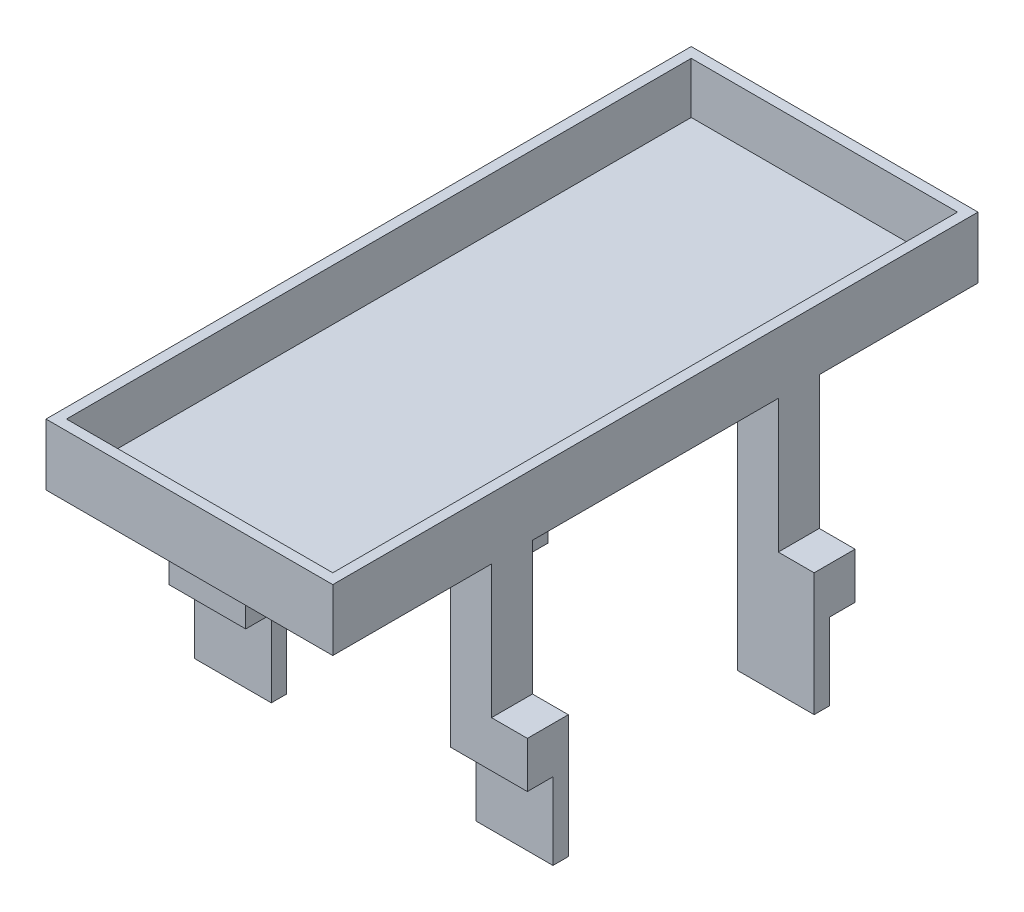
ISO-10303-21;
HEADER;
FILE_DESCRIPTION(('STEP AP214'),'2;1');
FILE_NAME('part.step','',(''),(''),'','','');
FILE_SCHEMA(('AUTOMOTIVE_DESIGN { 1 0 10303 214 1 1 1 1 }'));
ENDSEC;
DATA;
#1=APPLICATION_CONTEXT('core data for automotive mechanical design processes');
#2=APPLICATION_PROTOCOL_DEFINITION('international standard','automotive_design',2000,#1);
#3=PRODUCT_CONTEXT('',#1,'mechanical');
#4=PRODUCT('Part','Part','',(#3));
#5=PRODUCT_RELATED_PRODUCT_CATEGORY('part','',(#4));
#6=PRODUCT_DEFINITION_FORMATION('','',#4);
#7=PRODUCT_DEFINITION_CONTEXT('part definition',#1,'design');
#8=PRODUCT_DEFINITION('design','',#6,#7);
#9=PRODUCT_DEFINITION_SHAPE('','',#8);
#10=(LENGTH_UNIT() NAMED_UNIT(*) SI_UNIT(.MILLI.,.METRE.));
#11=(NAMED_UNIT(*) PLANE_ANGLE_UNIT() SI_UNIT($,.RADIAN.));
#12=(NAMED_UNIT(*) SI_UNIT($,.STERADIAN.) SOLID_ANGLE_UNIT());
#13=UNCERTAINTY_MEASURE_WITH_UNIT(LENGTH_MEASURE(1.E-05),#10,'distance_accuracy_value','');
#14=(GEOMETRIC_REPRESENTATION_CONTEXT(3) GLOBAL_UNCERTAINTY_ASSIGNED_CONTEXT((#13)) GLOBAL_UNIT_ASSIGNED_CONTEXT((#10,
#11,#12)) REPRESENTATION_CONTEXT('',''));
#15=CARTESIAN_POINT('',(0.,0.,0.));
#16=DIRECTION('',(0.,0.,1.));
#17=DIRECTION('',(1.,0.,0.));
#18=AXIS2_PLACEMENT_3D('',#15,#16,#17);
#19=CARTESIAN_POINT('',(35.,0.,-24.));
#20=DIRECTION('',(0.,0.,-1.));
#21=DIRECTION('',(0.,1.,0.));
#22=AXIS2_PLACEMENT_3D('',#19,#20,#21);
#23=PLANE('',#22);
#24=DIRECTION('',(-1.,0.,0.));
#25=VECTOR('',#24,1.);
#26=CARTESIAN_POINT('',(35.,0.,-24.));
#27=LINE('',#26,#25);
#28=CARTESIAN_POINT('',(-20.,0.,-24.));
#29=VERTEX_POINT('',#28);
#30=CARTESIAN_POINT('',(-28.,0.,-24.));
#31=VERTEX_POINT('',#30);
#32=EDGE_CURVE('E542',#29,#31,#27,.T.);
#33=ORIENTED_EDGE('',*,*,#32,.T.);
#34=DIRECTION('',(0.,-1.,0.));
#35=VECTOR('',#34,1.);
#36=CARTESIAN_POINT('',(-28.,0.,-24.));
#37=LINE('',#36,#35);
#38=CARTESIAN_POINT('',(-28.,-26.,-24.));
#39=VERTEX_POINT('',#38);
#40=EDGE_CURVE('E306',#31,#39,#37,.T.);
#41=ORIENTED_EDGE('',*,*,#40,.T.);
#42=DIRECTION('',(-1.,0.,0.));
#43=VECTOR('',#42,1.);
#44=CARTESIAN_POINT('',(35.,-26.,-24.));
#45=LINE('',#44,#43);
#46=CARTESIAN_POINT('',(-35.,-26.,-24.));
#47=VERTEX_POINT('',#46);
#48=EDGE_CURVE('E314',#39,#47,#45,.T.);
#49=ORIENTED_EDGE('',*,*,#48,.T.);
#50=DIRECTION('',(0.,-1.,0.));
#51=VECTOR('',#50,1.);
#52=CARTESIAN_POINT('',(-35.,0.,-24.));
#53=LINE('',#52,#51);
#54=CARTESIAN_POINT('',(-35.,-50.,-24.));
#55=VERTEX_POINT('',#54);
#56=EDGE_CURVE('E499',#47,#55,#53,.T.);
#57=ORIENTED_EDGE('',*,*,#56,.T.);
#58=DIRECTION('',(-1.,0.,0.));
#59=VECTOR('',#58,1.);
#60=CARTESIAN_POINT('',(35.,-50.,-24.));
#61=LINE('',#60,#59);
#62=CARTESIAN_POINT('',(-20.,-50.,-24.));
#63=VERTEX_POINT('',#62);
#64=EDGE_CURVE('E538',#63,#55,#61,.T.);
#65=ORIENTED_EDGE('',*,*,#64,.F.);
#66=DIRECTION('',(0.,1.,0.));
#67=VECTOR('',#66,1.);
#68=CARTESIAN_POINT('',(-20.,0.,-24.));
#69=LINE('',#68,#67);
#70=EDGE_CURVE('E380',#63,#29,#69,.T.);
#71=ORIENTED_EDGE('',*,*,#70,.T.);
#72=EDGE_LOOP('',(#33,#41,#49,#57,#65,#71));
#73=FACE_BOUND('',#72,.T.);
#74=ADVANCED_FACE('F37',(#73),#23,.F.);
#75=CARTESIAN_POINT('',(35.,-50.,-24.));
#76=DIRECTION('',(0.,1.,0.));
#77=DIRECTION('',(0.,0.,1.));
#78=AXIS2_PLACEMENT_3D('',#75,#76,#77);
#79=PLANE('',#78);
#80=DIRECTION('',(-1.,0.,0.));
#81=VECTOR('',#80,1.);
#82=CARTESIAN_POINT('',(35.,-50.,-27.));
#83=LINE('',#82,#81);
#84=CARTESIAN_POINT('',(-20.,-50.,-27.));
#85=VERTEX_POINT('',#84);
#86=CARTESIAN_POINT('',(-35.,-50.,-27.));
#87=VERTEX_POINT('',#86);
#88=EDGE_CURVE('E534',#85,#87,#83,.T.);
#89=ORIENTED_EDGE('',*,*,#88,.F.);
#90=DIRECTION('',(0.,0.,1.));
#91=VECTOR('',#90,1.);
#92=CARTESIAN_POINT('',(-20.,-50.,-63.));
#93=LINE('',#92,#91);
#94=EDGE_CURVE('E634',#85,#63,#93,.T.);
#95=ORIENTED_EDGE('',*,*,#94,.T.);
#96=ORIENTED_EDGE('',*,*,#64,.T.);
#97=DIRECTION('',(0.,0.,-1.));
#98=VECTOR('',#97,1.);
#99=CARTESIAN_POINT('',(-35.,-50.,-24.));
#100=LINE('',#99,#98);
#101=EDGE_CURVE('E514',#55,#87,#100,.T.);
#102=ORIENTED_EDGE('',*,*,#101,.T.);
#103=EDGE_LOOP('',(#89,#95,#96,#102));
#104=FACE_BOUND('',#103,.T.);
#105=ADVANCED_FACE('F655',(#104),#79,.F.);
#106=CARTESIAN_POINT('',(35.,-50.,-27.));
#107=DIRECTION('',(0.,0.,1.));
#108=DIRECTION('',(1.,0.,0.));
#109=AXIS2_PLACEMENT_3D('',#106,#107,#108);
#110=PLANE('',#109);
#111=DIRECTION('',(-1.,0.,0.));
#112=VECTOR('',#111,1.);
#113=CARTESIAN_POINT('',(35.,-35.,-27.));
#114=LINE('',#113,#112);
#115=CARTESIAN_POINT('',(-20.,-35.,-27.));
#116=VERTEX_POINT('',#115);
#117=CARTESIAN_POINT('',(-35.,-35.,-27.));
#118=VERTEX_POINT('',#117);
#119=EDGE_CURVE('E529',#116,#118,#114,.T.);
#120=ORIENTED_EDGE('',*,*,#119,.F.);
#121=DIRECTION('',(0.,-1.,0.));
#122=VECTOR('',#121,1.);
#123=CARTESIAN_POINT('',(-20.,-50.,-27.));
#124=LINE('',#123,#122);
#125=EDGE_CURVE('E377',#116,#85,#124,.T.);
#126=ORIENTED_EDGE('',*,*,#125,.T.);
#127=ORIENTED_EDGE('',*,*,#88,.T.);
#128=DIRECTION('',(0.,1.,0.));
#129=VECTOR('',#128,1.);
#130=CARTESIAN_POINT('',(-35.,-50.,-27.));
#131=LINE('',#130,#129);
#132=EDGE_CURVE('E517',#87,#118,#131,.T.);
#133=ORIENTED_EDGE('',*,*,#132,.T.);
#134=EDGE_LOOP('',(#120,#126,#127,#133));
#135=FACE_BOUND('',#134,.T.);
#136=ADVANCED_FACE('F659',(#135),#110,.F.);
#137=CARTESIAN_POINT('',(35.,-35.,-27.));
#138=DIRECTION('',(0.,1.,0.));
#139=DIRECTION('',(0.,0.,1.));
#140=AXIS2_PLACEMENT_3D('',#137,#138,#139);
#141=PLANE('',#140);
#142=DIRECTION('',(-1.,0.,0.));
#143=VECTOR('',#142,1.);
#144=CARTESIAN_POINT('',(35.,-35.,-32.));
#145=LINE('',#144,#143);
#146=CARTESIAN_POINT('',(-20.,-35.,-32.));
#147=VERTEX_POINT('',#146);
#148=CARTESIAN_POINT('',(-35.,-35.,-32.));
#149=VERTEX_POINT('',#148);
#150=EDGE_CURVE('E530',#147,#149,#145,.T.);
#151=ORIENTED_EDGE('',*,*,#150,.F.);
#152=DIRECTION('',(0.,0.,1.));
#153=VECTOR('',#152,1.);
#154=CARTESIAN_POINT('',(-20.,-35.,-27.));
#155=LINE('',#154,#153);
#156=EDGE_CURVE('E374',#147,#116,#155,.T.);
#157=ORIENTED_EDGE('',*,*,#156,.T.);
#158=ORIENTED_EDGE('',*,*,#119,.T.);
#159=DIRECTION('',(0.,0.,-1.));
#160=VECTOR('',#159,1.);
#161=CARTESIAN_POINT('',(-35.,-35.,-27.));
#162=LINE('',#161,#160);
#163=EDGE_CURVE('E520',#118,#149,#162,.T.);
#164=ORIENTED_EDGE('',*,*,#163,.T.);
#165=EDGE_LOOP('',(#151,#157,#158,#164));
#166=FACE_BOUND('',#165,.T.);
#167=ADVANCED_FACE('F606',(#166),#141,.F.);
#168=CARTESIAN_POINT('',(35.,-35.,-32.));
#169=DIRECTION('',(0.,0.,1.));
#170=DIRECTION('',(1.,0.,0.));
#171=AXIS2_PLACEMENT_3D('',#168,#169,#170);
#172=PLANE('',#171);
#173=DIRECTION('',(1.,0.,0.));
#174=VECTOR('',#173,1.);
#175=CARTESIAN_POINT('',(35.,-26.,-32.));
#176=LINE('',#175,#174);
#177=CARTESIAN_POINT('',(-35.,-26.,-32.));
#178=VERTEX_POINT('',#177);
#179=CARTESIAN_POINT('',(-28.,-26.,-32.));
#180=VERTEX_POINT('',#179);
#181=EDGE_CURVE('E311',#178,#180,#176,.T.);
#182=ORIENTED_EDGE('',*,*,#181,.T.);
#183=DIRECTION('',(0.,1.,0.));
#184=VECTOR('',#183,1.);
#185=CARTESIAN_POINT('',(-28.,-35.,-32.));
#186=LINE('',#185,#184);
#187=CARTESIAN_POINT('',(-28.,0.,-32.));
#188=VERTEX_POINT('',#187);
#189=EDGE_CURVE('E294',#180,#188,#186,.T.);
#190=ORIENTED_EDGE('',*,*,#189,.T.);
#191=DIRECTION('',(-1.,0.,0.));
#192=VECTOR('',#191,1.);
#193=CARTESIAN_POINT('',(35.,0.,-32.));
#194=LINE('',#193,#192);
#195=CARTESIAN_POINT('',(-20.,0.,-32.));
#196=VERTEX_POINT('',#195);
#197=EDGE_CURVE('E511',#196,#188,#194,.T.);
#198=ORIENTED_EDGE('',*,*,#197,.F.);
#199=DIRECTION('',(0.,-1.,0.));
#200=VECTOR('',#199,1.);
#201=CARTESIAN_POINT('',(-20.,-35.,-32.));
#202=LINE('',#201,#200);
#203=EDGE_CURVE('E371',#196,#147,#202,.T.);
#204=ORIENTED_EDGE('',*,*,#203,.T.);
#205=ORIENTED_EDGE('',*,*,#150,.T.);
#206=DIRECTION('',(0.,1.,0.));
#207=VECTOR('',#206,1.);
#208=CARTESIAN_POINT('',(-35.,-35.,-32.));
#209=LINE('',#208,#207);
#210=EDGE_CURVE('E321',#149,#178,#209,.T.);
#211=ORIENTED_EDGE('',*,*,#210,.T.);
#212=EDGE_LOOP('',(#182,#190,#198,#204,#205,#211));
#213=FACE_BOUND('',#212,.T.);
#214=ADVANCED_FACE('F319',(#213),#172,.F.);
#215=CARTESIAN_POINT('',(35.,-35.,32.));
#216=DIRECTION('',(0.,0.,-1.));
#217=DIRECTION('',(-1.,0.,0.));
#218=AXIS2_PLACEMENT_3D('',#215,#216,#217);
#219=PLANE('',#218);
#220=DIRECTION('',(-1.,0.,0.));
#221=VECTOR('',#220,1.);
#222=CARTESIAN_POINT('',(0.,0.,32.));
#223=LINE('',#222,#221);
#224=CARTESIAN_POINT('',(-20.,0.,32.));
#225=VERTEX_POINT('',#224);
#226=CARTESIAN_POINT('',(-28.,0.,32.));
#227=VERTEX_POINT('',#226);
#228=EDGE_CURVE('E549',#225,#227,#223,.T.);
#229=ORIENTED_EDGE('',*,*,#228,.T.);
#230=DIRECTION('',(0.,-1.,0.));
#231=VECTOR('',#230,1.);
#232=CARTESIAN_POINT('',(-28.,-35.,32.));
#233=LINE('',#232,#231);
#234=CARTESIAN_POINT('',(-28.,-26.,32.));
#235=VERTEX_POINT('',#234);
#236=EDGE_CURVE('E307',#227,#235,#233,.T.);
#237=ORIENTED_EDGE('',*,*,#236,.T.);
#238=DIRECTION('',(-1.,0.,0.));
#239=VECTOR('',#238,1.);
#240=CARTESIAN_POINT('',(35.,-26.,32.));
#241=LINE('',#240,#239);
#242=CARTESIAN_POINT('',(-35.,-26.,32.));
#243=VERTEX_POINT('',#242);
#244=EDGE_CURVE('E322',#235,#243,#241,.T.);
#245=ORIENTED_EDGE('',*,*,#244,.T.);
#246=DIRECTION('',(0.,-1.,0.));
#247=VECTOR('',#246,1.);
#248=CARTESIAN_POINT('',(-35.,-35.,32.));
#249=LINE('',#248,#247);
#250=CARTESIAN_POINT('',(-35.,-35.,32.));
#251=VERTEX_POINT('',#250);
#252=EDGE_CURVE('E455',#243,#251,#249,.T.);
#253=ORIENTED_EDGE('',*,*,#252,.T.);
#254=DIRECTION('',(-1.,0.,0.));
#255=VECTOR('',#254,1.);
#256=CARTESIAN_POINT('',(35.,-35.,32.));
#257=LINE('',#256,#255);
#258=CARTESIAN_POINT('',(-20.,-35.,32.));
#259=VERTEX_POINT('',#258);
#260=EDGE_CURVE('E419',#259,#251,#257,.T.);
#261=ORIENTED_EDGE('',*,*,#260,.F.);
#262=DIRECTION('',(0.,1.,0.));
#263=VECTOR('',#262,1.);
#264=CARTESIAN_POINT('',(-20.,-35.,32.));
#265=LINE('',#264,#263);
#266=EDGE_CURVE('E368',#259,#225,#265,.T.);
#267=ORIENTED_EDGE('',*,*,#266,.T.);
#268=EDGE_LOOP('',(#229,#237,#245,#253,#261,#267));
#269=FACE_BOUND('',#268,.T.);
#270=ADVANCED_FACE('F725',(#269),#219,.F.);
#271=CARTESIAN_POINT('',(35.,-35.,27.));
#272=DIRECTION('',(0.,1.,0.));
#273=DIRECTION('',(0.,0.,1.));
#274=AXIS2_PLACEMENT_3D('',#271,#272,#273);
#275=PLANE('',#274);
#276=DIRECTION('',(-1.,0.,0.));
#277=VECTOR('',#276,1.);
#278=CARTESIAN_POINT('',(35.,-35.,27.));
#279=LINE('',#278,#277);
#280=CARTESIAN_POINT('',(-20.,-35.,27.));
#281=VERTEX_POINT('',#280);
#282=CARTESIAN_POINT('',(-35.,-35.,27.));
#283=VERTEX_POINT('',#282);
#284=EDGE_CURVE('E429',#281,#283,#279,.T.);
#285=ORIENTED_EDGE('',*,*,#284,.F.);
#286=DIRECTION('',(0.,0.,1.));
#287=VECTOR('',#286,1.);
#288=CARTESIAN_POINT('',(-20.,-35.,27.));
#289=LINE('',#288,#287);
#290=EDGE_CURVE('E365',#281,#259,#289,.T.);
#291=ORIENTED_EDGE('',*,*,#290,.T.);
#292=ORIENTED_EDGE('',*,*,#260,.T.);
#293=DIRECTION('',(0.,0.,-1.));
#294=VECTOR('',#293,1.);
#295=CARTESIAN_POINT('',(-35.,-35.,27.));
#296=LINE('',#295,#294);
#297=EDGE_CURVE('E452',#251,#283,#296,.T.);
#298=ORIENTED_EDGE('',*,*,#297,.T.);
#299=EDGE_LOOP('',(#285,#291,#292,#298));
#300=FACE_BOUND('',#299,.T.);
#301=ADVANCED_FACE('F717',(#300),#275,.F.);
#302=CARTESIAN_POINT('',(35.,-50.,27.));
#303=DIRECTION('',(0.,0.,-1.));
#304=DIRECTION('',(-1.,0.,0.));
#305=AXIS2_PLACEMENT_3D('',#302,#303,#304);
#306=PLANE('',#305);
#307=DIRECTION('',(-1.,0.,0.));
#308=VECTOR('',#307,1.);
#309=CARTESIAN_POINT('',(35.,-50.,27.));
#310=LINE('',#309,#308);
#311=CARTESIAN_POINT('',(-20.,-50.,27.));
#312=VERTEX_POINT('',#311);
#313=CARTESIAN_POINT('',(-35.,-50.,27.));
#314=VERTEX_POINT('',#313);
#315=EDGE_CURVE('E433',#312,#314,#310,.T.);
#316=ORIENTED_EDGE('',*,*,#315,.F.);
#317=DIRECTION('',(0.,1.,0.));
#318=VECTOR('',#317,1.);
#319=CARTESIAN_POINT('',(-20.,-50.,27.));
#320=LINE('',#319,#318);
#321=EDGE_CURVE('E362',#312,#281,#320,.T.);
#322=ORIENTED_EDGE('',*,*,#321,.T.);
#323=ORIENTED_EDGE('',*,*,#284,.T.);
#324=DIRECTION('',(0.,-1.,0.));
#325=VECTOR('',#324,1.);
#326=CARTESIAN_POINT('',(-35.,-50.,27.));
#327=LINE('',#326,#325);
#328=EDGE_CURVE('E449',#283,#314,#327,.T.);
#329=ORIENTED_EDGE('',*,*,#328,.T.);
#330=EDGE_LOOP('',(#316,#322,#323,#329));
#331=FACE_BOUND('',#330,.T.);
#332=ADVANCED_FACE('F723',(#331),#306,.F.);
#333=CARTESIAN_POINT('',(35.,-50.,24.));
#334=DIRECTION('',(0.,1.,0.));
#335=DIRECTION('',(0.,0.,1.));
#336=AXIS2_PLACEMENT_3D('',#333,#334,#335);
#337=PLANE('',#336);
#338=DIRECTION('',(-1.,0.,0.));
#339=VECTOR('',#338,1.);
#340=CARTESIAN_POINT('',(35.,-50.,24.));
#341=LINE('',#340,#339);
#342=CARTESIAN_POINT('',(-20.,-50.,24.));
#343=VERTEX_POINT('',#342);
#344=CARTESIAN_POINT('',(-35.,-50.,24.));
#345=VERTEX_POINT('',#344);
#346=EDGE_CURVE('E437',#343,#345,#341,.T.);
#347=ORIENTED_EDGE('',*,*,#346,.F.);
#348=EDGE_CURVE('E637',#343,#312,#93,.T.);
#349=ORIENTED_EDGE('',*,*,#348,.T.);
#350=ORIENTED_EDGE('',*,*,#315,.T.);
#351=DIRECTION('',(0.,0.,-1.));
#352=VECTOR('',#351,1.);
#353=CARTESIAN_POINT('',(-35.,-50.,24.));
#354=LINE('',#353,#352);
#355=EDGE_CURVE('E445',#314,#345,#354,.T.);
#356=ORIENTED_EDGE('',*,*,#355,.T.);
#357=EDGE_LOOP('',(#347,#349,#350,#356));
#358=FACE_BOUND('',#357,.T.);
#359=ADVANCED_FACE('F677',(#358),#337,.F.);
#360=CARTESIAN_POINT('',(35.,0.,24.));
#361=DIRECTION('',(0.,0.,1.));
#362=DIRECTION('',(0.,-1.,0.));
#363=AXIS2_PLACEMENT_3D('',#360,#361,#362);
#364=PLANE('',#363);
#365=DIRECTION('',(1.,0.,0.));
#366=VECTOR('',#365,1.);
#367=CARTESIAN_POINT('',(35.,-26.,24.));
#368=LINE('',#367,#366);
#369=CARTESIAN_POINT('',(-35.,-26.,24.));
#370=VERTEX_POINT('',#369);
#371=CARTESIAN_POINT('',(-28.,-26.,24.));
#372=VERTEX_POINT('',#371);
#373=EDGE_CURVE('E327',#370,#372,#368,.T.);
#374=ORIENTED_EDGE('',*,*,#373,.T.);
#375=DIRECTION('',(0.,1.,0.));
#376=VECTOR('',#375,1.);
#377=CARTESIAN_POINT('',(-28.,0.,24.));
#378=LINE('',#377,#376);
#379=CARTESIAN_POINT('',(-28.,0.,24.));
#380=VERTEX_POINT('',#379);
#381=EDGE_CURVE('E45',#372,#380,#378,.T.);
#382=ORIENTED_EDGE('',*,*,#381,.T.);
#383=DIRECTION('',(1.,0.,0.));
#384=VECTOR('',#383,1.);
#385=CARTESIAN_POINT('',(0.,0.,24.));
#386=LINE('',#385,#384);
#387=CARTESIAN_POINT('',(-20.,0.,24.));
#388=VERTEX_POINT('',#387);
#389=EDGE_CURVE('E546',#380,#388,#386,.T.);
#390=ORIENTED_EDGE('',*,*,#389,.T.);
#391=DIRECTION('',(0.,-1.,0.));
#392=VECTOR('',#391,1.);
#393=CARTESIAN_POINT('',(-20.,0.,24.));
#394=LINE('',#393,#392);
#395=EDGE_CURVE('E561',#388,#343,#394,.T.);
#396=ORIENTED_EDGE('',*,*,#395,.T.);
#397=ORIENTED_EDGE('',*,*,#346,.T.);
#398=DIRECTION('',(0.,1.,0.));
#399=VECTOR('',#398,1.);
#400=CARTESIAN_POINT('',(-35.,0.,24.));
#401=LINE('',#400,#399);
#402=EDGE_CURVE('E442',#345,#370,#401,.T.);
#403=ORIENTED_EDGE('',*,*,#402,.T.);
#404=EDGE_LOOP('',(#374,#382,#390,#396,#397,#403));
#405=FACE_BOUND('',#404,.T.);
#406=ADVANCED_FACE('F566',(#405),#364,.F.);
#407=DIRECTION('',(0.,-1.,0.));
#408=VECTOR('',#407,1.);
#409=CARTESIAN_POINT('',(35.,0.,-24.));
#410=LINE('',#409,#408);
#411=CARTESIAN_POINT('',(35.,-26.,-24.));
#412=VERTEX_POINT('',#411);
#413=CARTESIAN_POINT('',(35.,-50.,-24.));
#414=VERTEX_POINT('',#413);
#415=EDGE_CURVE('E500',#412,#414,#410,.T.);
#416=ORIENTED_EDGE('',*,*,#415,.F.);
#417=DIRECTION('',(-1.,0.,0.));
#418=VECTOR('',#417,1.);
#419=CARTESIAN_POINT('',(35.,-26.,-24.));
#420=LINE('',#419,#418);
#421=CARTESIAN_POINT('',(28.,-26.,-24.));
#422=VERTEX_POINT('',#421);
#423=EDGE_CURVE('E339',#412,#422,#420,.T.);
#424=ORIENTED_EDGE('',*,*,#423,.T.);
#425=DIRECTION('',(0.,1.,0.));
#426=VECTOR('',#425,1.);
#427=CARTESIAN_POINT('',(28.,0.,-24.));
#428=LINE('',#427,#426);
#429=CARTESIAN_POINT('',(28.,0.,-24.));
#430=VERTEX_POINT('',#429);
#431=EDGE_CURVE('E391',#422,#430,#428,.T.);
#432=ORIENTED_EDGE('',*,*,#431,.T.);
#433=CARTESIAN_POINT('',(20.,0.,-24.));
#434=VERTEX_POINT('',#433);
#435=EDGE_CURVE('E545',#430,#434,#27,.T.);
#436=ORIENTED_EDGE('',*,*,#435,.T.);
#437=DIRECTION('',(0.,-1.,0.));
#438=VECTOR('',#437,1.);
#439=CARTESIAN_POINT('',(20.,0.,-24.));
#440=LINE('',#439,#438);
#441=CARTESIAN_POINT('',(20.,-50.,-24.));
#442=VERTEX_POINT('',#441);
#443=EDGE_CURVE('E359',#434,#442,#440,.T.);
#444=ORIENTED_EDGE('',*,*,#443,.T.);
#445=EDGE_CURVE('E539',#414,#442,#61,.T.);
#446=ORIENTED_EDGE('',*,*,#445,.F.);
#447=EDGE_LOOP('',(#416,#424,#432,#436,#444,#446));
#448=FACE_BOUND('',#447,.T.);
#449=ADVANCED_FACE('F39',(#448),#23,.F.);
#450=ORIENTED_EDGE('',*,*,#445,.T.);
#451=DIRECTION('',(0.,0.,1.));
#452=VECTOR('',#451,1.);
#453=CARTESIAN_POINT('',(20.,-50.,-63.));
#454=LINE('',#453,#452);
#455=CARTESIAN_POINT('',(20.,-50.,-27.));
#456=VERTEX_POINT('',#455);
#457=EDGE_CURVE('E626',#456,#442,#454,.T.);
#458=ORIENTED_EDGE('',*,*,#457,.F.);
#459=CARTESIAN_POINT('',(35.,-50.,-27.));
#460=VERTEX_POINT('',#459);
#461=EDGE_CURVE('E535',#460,#456,#83,.T.);
#462=ORIENTED_EDGE('',*,*,#461,.F.);
#463=DIRECTION('',(0.,0.,-1.));
#464=VECTOR('',#463,1.);
#465=CARTESIAN_POINT('',(35.,-50.,-24.));
#466=LINE('',#465,#464);
#467=EDGE_CURVE('E502',#414,#460,#466,.T.);
#468=ORIENTED_EDGE('',*,*,#467,.F.);
#469=EDGE_LOOP('',(#450,#458,#462,#468));
#470=FACE_BOUND('',#469,.T.);
#471=ADVANCED_FACE('F628',(#470),#79,.F.);
#472=ORIENTED_EDGE('',*,*,#461,.T.);
#473=DIRECTION('',(0.,1.,0.));
#474=VECTOR('',#473,1.);
#475=CARTESIAN_POINT('',(20.,-50.,-27.));
#476=LINE('',#475,#474);
#477=CARTESIAN_POINT('',(20.,-35.,-27.));
#478=VERTEX_POINT('',#477);
#479=EDGE_CURVE('E356',#456,#478,#476,.T.);
#480=ORIENTED_EDGE('',*,*,#479,.T.);
#481=CARTESIAN_POINT('',(35.,-35.,-27.));
#482=VERTEX_POINT('',#481);
#483=EDGE_CURVE('E531',#482,#478,#114,.T.);
#484=ORIENTED_EDGE('',*,*,#483,.F.);
#485=DIRECTION('',(0.,1.,0.));
#486=VECTOR('',#485,1.);
#487=CARTESIAN_POINT('',(35.,-50.,-27.));
#488=LINE('',#487,#486);
#489=EDGE_CURVE('E504',#460,#482,#488,.T.);
#490=ORIENTED_EDGE('',*,*,#489,.F.);
#491=EDGE_LOOP('',(#472,#480,#484,#490));
#492=FACE_BOUND('',#491,.T.);
#493=ADVANCED_FACE('F623',(#492),#110,.F.);
#494=ORIENTED_EDGE('',*,*,#483,.T.);
#495=DIRECTION('',(0.,0.,-1.));
#496=VECTOR('',#495,1.);
#497=CARTESIAN_POINT('',(20.,-35.,-27.));
#498=LINE('',#497,#496);
#499=CARTESIAN_POINT('',(20.,-35.,-32.));
#500=VERTEX_POINT('',#499);
#501=EDGE_CURVE('E353',#478,#500,#498,.T.);
#502=ORIENTED_EDGE('',*,*,#501,.T.);
#503=CARTESIAN_POINT('',(35.,-35.,-32.));
#504=VERTEX_POINT('',#503);
#505=EDGE_CURVE('E526',#504,#500,#145,.T.);
#506=ORIENTED_EDGE('',*,*,#505,.F.);
#507=DIRECTION('',(0.,0.,-1.));
#508=VECTOR('',#507,1.);
#509=CARTESIAN_POINT('',(35.,-35.,-27.));
#510=LINE('',#509,#508);
#511=EDGE_CURVE('E506',#482,#504,#510,.T.);
#512=ORIENTED_EDGE('',*,*,#511,.F.);
#513=EDGE_LOOP('',(#494,#502,#506,#512));
#514=FACE_BOUND('',#513,.T.);
#515=ADVANCED_FACE('F618',(#514),#141,.F.);
#516=DIRECTION('',(0.,-1.,0.));
#517=VECTOR('',#516,1.);
#518=CARTESIAN_POINT('',(28.,-35.,-32.));
#519=LINE('',#518,#517);
#520=CARTESIAN_POINT('',(28.,0.,-32.));
#521=VERTEX_POINT('',#520);
#522=CARTESIAN_POINT('',(28.,-26.,-32.));
#523=VERTEX_POINT('',#522);
#524=EDGE_CURVE('E388',#521,#523,#519,.T.);
#525=ORIENTED_EDGE('',*,*,#524,.T.);
#526=DIRECTION('',(1.,0.,0.));
#527=VECTOR('',#526,1.);
#528=CARTESIAN_POINT('',(35.,-26.,-32.));
#529=LINE('',#528,#527);
#530=CARTESIAN_POINT('',(35.,-26.,-32.));
#531=VERTEX_POINT('',#530);
#532=EDGE_CURVE('E336',#523,#531,#529,.T.);
#533=ORIENTED_EDGE('',*,*,#532,.T.);
#534=DIRECTION('',(0.,1.,0.));
#535=VECTOR('',#534,1.);
#536=CARTESIAN_POINT('',(35.,-35.,-32.));
#537=LINE('',#536,#535);
#538=EDGE_CURVE('E508',#504,#531,#537,.T.);
#539=ORIENTED_EDGE('',*,*,#538,.F.);
#540=ORIENTED_EDGE('',*,*,#505,.T.);
#541=DIRECTION('',(0.,1.,0.));
#542=VECTOR('',#541,1.);
#543=CARTESIAN_POINT('',(20.,-35.,-32.));
#544=LINE('',#543,#542);
#545=CARTESIAN_POINT('',(20.,0.,-32.));
#546=VERTEX_POINT('',#545);
#547=EDGE_CURVE('E351',#500,#546,#544,.T.);
#548=ORIENTED_EDGE('',*,*,#547,.T.);
#549=EDGE_CURVE('E525',#521,#546,#194,.T.);
#550=ORIENTED_EDGE('',*,*,#549,.F.);
#551=EDGE_LOOP('',(#525,#533,#539,#540,#548,#550));
#552=FACE_BOUND('',#551,.T.);
#553=ADVANCED_FACE('F613',(#552),#172,.F.);
#554=CARTESIAN_POINT('',(35.,0.,0.));
#555=DIRECTION('',(1.,0.,0.));
#556=DIRECTION('',(0.,0.,-1.));
#557=AXIS2_PLACEMENT_3D('',#554,#555,#556);
#558=PLANE('',#557);
#559=DIRECTION('',(0.,0.,1.));
#560=VECTOR('',#559,1.);
#561=CARTESIAN_POINT('',(35.,-26.,-63.));
#562=LINE('',#561,#560);
#563=EDGE_CURVE('E640',#531,#412,#562,.T.);
#564=ORIENTED_EDGE('',*,*,#563,.T.);
#565=ORIENTED_EDGE('',*,*,#415,.T.);
#566=ORIENTED_EDGE('',*,*,#467,.T.);
#567=ORIENTED_EDGE('',*,*,#489,.T.);
#568=ORIENTED_EDGE('',*,*,#511,.T.);
#569=ORIENTED_EDGE('',*,*,#538,.T.);
#570=EDGE_LOOP('',(#564,#565,#566,#567,#568,#569));
#571=FACE_BOUND('',#570,.T.);
#572=ADVANCED_FACE('F682',(#571),#558,.T.);
#573=CARTESIAN_POINT('',(-35.,0.,0.));
#574=DIRECTION('',(1.,0.,0.));
#575=DIRECTION('',(0.,0.,-1.));
#576=AXIS2_PLACEMENT_3D('',#573,#574,#575);
#577=PLANE('',#576);
#578=ORIENTED_EDGE('',*,*,#56,.F.);
#579=DIRECTION('',(0.,0.,1.));
#580=VECTOR('',#579,1.);
#581=CARTESIAN_POINT('',(-35.,-26.,-63.));
#582=LINE('',#581,#580);
#583=EDGE_CURVE('E315',#178,#47,#582,.T.);
#584=ORIENTED_EDGE('',*,*,#583,.F.);
#585=ORIENTED_EDGE('',*,*,#210,.F.);
#586=ORIENTED_EDGE('',*,*,#163,.F.);
#587=ORIENTED_EDGE('',*,*,#132,.F.);
#588=ORIENTED_EDGE('',*,*,#101,.F.);
#589=EDGE_LOOP('',(#578,#584,#585,#586,#587,#588));
#590=FACE_BOUND('',#589,.T.);
#591=ADVANCED_FACE('F651',(#590),#577,.F.);
#592=CARTESIAN_POINT('',(0.,0.,0.));
#593=DIRECTION('',(0.,1.,0.));
#594=DIRECTION('',(0.,0.,1.));
#595=AXIS2_PLACEMENT_3D('',#592,#593,#594);
#596=PLANE('',#595);
#597=ORIENTED_EDGE('',*,*,#549,.T.);
#598=DIRECTION('',(0.,0.,1.));
#599=VECTOR('',#598,1.);
#600=CARTESIAN_POINT('',(20.,0.,-63.));
#601=LINE('',#600,#599);
#602=EDGE_CURVE('E52',#546,#434,#601,.T.);
#603=ORIENTED_EDGE('',*,*,#602,.T.);
#604=ORIENTED_EDGE('',*,*,#435,.F.);
#605=DIRECTION('',(0.,0.,-1.));
#606=VECTOR('',#605,1.);
#607=CARTESIAN_POINT('',(28.,0.,-63.));
#608=LINE('',#607,#606);
#609=CARTESIAN_POINT('',(28.,0.,24.));
#610=VERTEX_POINT('',#609);
#611=EDGE_CURVE('E483',#610,#430,#608,.T.);
#612=ORIENTED_EDGE('',*,*,#611,.F.);
#613=CARTESIAN_POINT('',(20.,0.,24.));
#614=VERTEX_POINT('',#613);
#615=EDGE_CURVE('E550',#614,#610,#386,.T.);
#616=ORIENTED_EDGE('',*,*,#615,.F.);
#617=CARTESIAN_POINT('',(20.,0.,32.));
#618=VERTEX_POINT('',#617);
#619=EDGE_CURVE('E60',#614,#618,#601,.T.);
#620=ORIENTED_EDGE('',*,*,#619,.T.);
#621=CARTESIAN_POINT('',(28.,0.,32.));
#622=VERTEX_POINT('',#621);
#623=EDGE_CURVE('E551',#622,#618,#223,.T.);
#624=ORIENTED_EDGE('',*,*,#623,.F.);
#625=CARTESIAN_POINT('',(28.,0.,63.));
#626=VERTEX_POINT('',#625);
#627=EDGE_CURVE('E479',#626,#622,#608,.T.);
#628=ORIENTED_EDGE('',*,*,#627,.F.);
#629=DIRECTION('',(1.,0.,0.));
#630=VECTOR('',#629,1.);
#631=CARTESIAN_POINT('',(-28.,0.,63.));
#632=LINE('',#631,#630);
#633=CARTESIAN_POINT('',(-28.,0.,63.));
#634=VERTEX_POINT('',#633);
#635=EDGE_CURVE('E472',#634,#626,#632,.T.);
#636=ORIENTED_EDGE('',*,*,#635,.F.);
#637=DIRECTION('',(0.,0.,1.));
#638=VECTOR('',#637,1.);
#639=CARTESIAN_POINT('',(-28.,0.,-63.));
#640=LINE('',#639,#638);
#641=EDGE_CURVE('E485',#227,#634,#640,.T.);
#642=ORIENTED_EDGE('',*,*,#641,.F.);
#643=ORIENTED_EDGE('',*,*,#228,.F.);
#644=DIRECTION('',(0.,0.,1.));
#645=VECTOR('',#644,1.);
#646=CARTESIAN_POINT('',(-20.,0.,-63.));
#647=LINE('',#646,#645);
#648=EDGE_CURVE('E577',#388,#225,#647,.T.);
#649=ORIENTED_EDGE('',*,*,#648,.F.);
#650=ORIENTED_EDGE('',*,*,#389,.F.);
#651=EDGE_CURVE('E487',#31,#380,#640,.T.);
#652=ORIENTED_EDGE('',*,*,#651,.F.);
#653=ORIENTED_EDGE('',*,*,#32,.F.);
#654=EDGE_CURVE('E602',#196,#29,#647,.T.);
#655=ORIENTED_EDGE('',*,*,#654,.F.);
#656=ORIENTED_EDGE('',*,*,#197,.T.);
#657=CARTESIAN_POINT('',(-28.,0.,-63.));
#658=VERTEX_POINT('',#657);
#659=EDGE_CURVE('E301',#658,#188,#640,.T.);
#660=ORIENTED_EDGE('',*,*,#659,.F.);
#661=DIRECTION('',(-1.,0.,0.));
#662=VECTOR('',#661,1.);
#663=CARTESIAN_POINT('',(-28.,0.,-63.));
#664=LINE('',#663,#662);
#665=CARTESIAN_POINT('',(28.,0.,-63.));
#666=VERTEX_POINT('',#665);
#667=EDGE_CURVE('E482',#666,#658,#664,.T.);
#668=ORIENTED_EDGE('',*,*,#667,.F.);
#669=EDGE_CURVE('E458',#521,#666,#608,.T.);
#670=ORIENTED_EDGE('',*,*,#669,.F.);
#671=EDGE_LOOP('',(#597,#603,#604,#612,#616,#620,#624,#628,#636,#642,#643,#649,#650,#652,#653,
#655,#656,#660,#668,#670));
#672=FACE_BOUND('',#671,.T.);
#673=ADVANCED_FACE('F574',(#672),#596,.F.);
#674=CARTESIAN_POINT('',(28.,12.,-63.));
#675=DIRECTION('',(-1.,0.,0.));
#676=DIRECTION('',(0.,0.,1.));
#677=AXIS2_PLACEMENT_3D('',#674,#675,#676);
#678=PLANE('',#677);
#679=ORIENTED_EDGE('',*,*,#627,.T.);
#680=DIRECTION('',(0.,1.,0.));
#681=VECTOR('',#680,1.);
#682=CARTESIAN_POINT('',(28.,-35.,32.));
#683=LINE('',#682,#681);
#684=CARTESIAN_POINT('',(28.,-26.,32.));
#685=VERTEX_POINT('',#684);
#686=EDGE_CURVE('E386',#685,#622,#683,.T.);
#687=ORIENTED_EDGE('',*,*,#686,.F.);
#688=DIRECTION('',(0.,0.,1.));
#689=VECTOR('',#688,1.);
#690=CARTESIAN_POINT('',(28.,-26.,-63.));
#691=LINE('',#690,#689);
#692=CARTESIAN_POINT('',(28.,-26.,24.));
#693=VERTEX_POINT('',#692);
#694=EDGE_CURVE('E643',#693,#685,#691,.T.);
#695=ORIENTED_EDGE('',*,*,#694,.F.);
#696=DIRECTION('',(0.,-1.,0.));
#697=VECTOR('',#696,1.);
#698=CARTESIAN_POINT('',(28.,0.,24.));
#699=LINE('',#698,#697);
#700=EDGE_CURVE('E11',#610,#693,#699,.T.);
#701=ORIENTED_EDGE('',*,*,#700,.F.);
#702=ORIENTED_EDGE('',*,*,#611,.T.);
#703=ORIENTED_EDGE('',*,*,#431,.F.);
#704=EDGE_CURVE('E644',#523,#422,#691,.T.);
#705=ORIENTED_EDGE('',*,*,#704,.F.);
#706=ORIENTED_EDGE('',*,*,#524,.F.);
#707=ORIENTED_EDGE('',*,*,#669,.T.);
#708=DIRECTION('',(0.,-1.,0.));
#709=VECTOR('',#708,1.);
#710=CARTESIAN_POINT('',(28.,12.,-63.));
#711=LINE('',#710,#709);
#712=CARTESIAN_POINT('',(28.,12.,-63.));
#713=VERTEX_POINT('',#712);
#714=EDGE_CURVE('E496',#713,#666,#711,.T.);
#715=ORIENTED_EDGE('',*,*,#714,.F.);
#716=DIRECTION('',(0.,0.,-1.));
#717=VECTOR('',#716,1.);
#718=CARTESIAN_POINT('',(28.,12.,-63.));
#719=LINE('',#718,#717);
#720=CARTESIAN_POINT('',(28.,12.,63.));
#721=VERTEX_POINT('',#720);
#722=EDGE_CURVE('E468',#721,#713,#719,.T.);
#723=ORIENTED_EDGE('',*,*,#722,.F.);
#724=DIRECTION('',(0.,-1.,0.));
#725=VECTOR('',#724,1.);
#726=CARTESIAN_POINT('',(28.,12.,63.));
#727=LINE('',#726,#725);
#728=EDGE_CURVE('E478',#721,#626,#727,.T.);
#729=ORIENTED_EDGE('',*,*,#728,.T.);
#730=EDGE_LOOP('',(#679,#687,#695,#701,#702,#703,#705,#706,#707,#715,#723,#729));
#731=FACE_BOUND('',#730,.T.);
#732=ADVANCED_FACE('F590',(#731),#678,.F.);
#733=CARTESIAN_POINT('',(-28.,12.,-63.));
#734=DIRECTION('',(0.,0.,1.));
#735=DIRECTION('',(0.,-1.,0.));
#736=AXIS2_PLACEMENT_3D('',#733,#734,#735);
#737=PLANE('',#736);
#738=ORIENTED_EDGE('',*,*,#667,.T.);
#739=DIRECTION('',(0.,-1.,0.));
#740=VECTOR('',#739,1.);
#741=CARTESIAN_POINT('',(-28.,12.,-63.));
#742=LINE('',#741,#740);
#743=CARTESIAN_POINT('',(-28.,12.,-63.));
#744=VERTEX_POINT('',#743);
#745=EDGE_CURVE('E494',#744,#658,#742,.T.);
#746=ORIENTED_EDGE('',*,*,#745,.F.);
#747=DIRECTION('',(-1.,0.,0.));
#748=VECTOR('',#747,1.);
#749=CARTESIAN_POINT('',(-28.,12.,-63.));
#750=LINE('',#749,#748);
#751=EDGE_CURVE('E471',#713,#744,#750,.T.);
#752=ORIENTED_EDGE('',*,*,#751,.F.);
#753=ORIENTED_EDGE('',*,*,#714,.T.);
#754=EDGE_LOOP('',(#738,#746,#752,#753));
#755=FACE_BOUND('',#754,.T.);
#756=ADVANCED_FACE('F892',(#755),#737,.F.);
#757=CARTESIAN_POINT('',(-28.,12.,-63.));
#758=DIRECTION('',(1.,0.,0.));
#759=DIRECTION('',(0.,0.,-1.));
#760=AXIS2_PLACEMENT_3D('',#757,#758,#759);
#761=PLANE('',#760);
#762=ORIENTED_EDGE('',*,*,#659,.T.);
#763=ORIENTED_EDGE('',*,*,#189,.F.);
#764=DIRECTION('',(0.,0.,1.));
#765=VECTOR('',#764,1.);
#766=CARTESIAN_POINT('',(-28.,-26.,-63.));
#767=LINE('',#766,#765);
#768=EDGE_CURVE('E297',#180,#39,#767,.T.);
#769=ORIENTED_EDGE('',*,*,#768,.T.);
#770=ORIENTED_EDGE('',*,*,#40,.F.);
#771=ORIENTED_EDGE('',*,*,#651,.T.);
#772=ORIENTED_EDGE('',*,*,#381,.F.);
#773=EDGE_CURVE('E316',#372,#235,#767,.T.);
#774=ORIENTED_EDGE('',*,*,#773,.T.);
#775=ORIENTED_EDGE('',*,*,#236,.F.);
#776=ORIENTED_EDGE('',*,*,#641,.T.);
#777=DIRECTION('',(0.,-1.,0.));
#778=VECTOR('',#777,1.);
#779=CARTESIAN_POINT('',(-28.,12.,63.));
#780=LINE('',#779,#778);
#781=CARTESIAN_POINT('',(-28.,12.,63.));
#782=VERTEX_POINT('',#781);
#783=EDGE_CURVE('E491',#782,#634,#780,.T.);
#784=ORIENTED_EDGE('',*,*,#783,.F.);
#785=DIRECTION('',(0.,0.,1.));
#786=VECTOR('',#785,1.);
#787=CARTESIAN_POINT('',(-28.,12.,-63.));
#788=LINE('',#787,#786);
#789=EDGE_CURVE('E474',#744,#782,#788,.T.);
#790=ORIENTED_EDGE('',*,*,#789,.F.);
#791=ORIENTED_EDGE('',*,*,#745,.T.);
#792=EDGE_LOOP('',(#762,#763,#769,#770,#771,#772,#774,#775,#776,#784,#790,#791));
#793=FACE_BOUND('',#792,.T.);
#794=ADVANCED_FACE('F296',(#793),#761,.F.);
#795=CARTESIAN_POINT('',(-28.,12.,63.));
#796=DIRECTION('',(0.,0.,-1.));
#797=DIRECTION('',(0.,1.,0.));
#798=AXIS2_PLACEMENT_3D('',#795,#796,#797);
#799=PLANE('',#798);
#800=ORIENTED_EDGE('',*,*,#635,.T.);
#801=ORIENTED_EDGE('',*,*,#728,.F.);
#802=DIRECTION('',(1.,0.,0.));
#803=VECTOR('',#802,1.);
#804=CARTESIAN_POINT('',(-28.,12.,63.));
#805=LINE('',#804,#803);
#806=EDGE_CURVE('E476',#782,#721,#805,.T.);
#807=ORIENTED_EDGE('',*,*,#806,.F.);
#808=ORIENTED_EDGE('',*,*,#783,.T.);
#809=EDGE_LOOP('',(#800,#801,#807,#808));
#810=FACE_BOUND('',#809,.T.);
#811=ADVANCED_FACE('F585',(#810),#799,.F.);
#812=CARTESIAN_POINT('',(0.,12.,0.));
#813=DIRECTION('',(0.,1.,0.));
#814=DIRECTION('',(0.,0.,1.));
#815=AXIS2_PLACEMENT_3D('',#812,#813,#814);
#816=PLANE('',#815);
#817=DIRECTION('',(0.,0.,-1.));
#818=VECTOR('',#817,1.);
#819=CARTESIAN_POINT('',(26.,12.,-61.));
#820=LINE('',#819,#818);
#821=CARTESIAN_POINT('',(26.,12.,61.));
#822=VERTEX_POINT('',#821);
#823=CARTESIAN_POINT('',(26.,12.,-61.));
#824=VERTEX_POINT('',#823);
#825=EDGE_CURVE('E393',#822,#824,#820,.T.);
#826=ORIENTED_EDGE('',*,*,#825,.F.);
#827=DIRECTION('',(1.,0.,0.));
#828=VECTOR('',#827,1.);
#829=CARTESIAN_POINT('',(-26.,12.,61.));
#830=LINE('',#829,#828);
#831=CARTESIAN_POINT('',(-26.,12.,61.));
#832=VERTEX_POINT('',#831);
#833=EDGE_CURVE('E398',#832,#822,#830,.T.);
#834=ORIENTED_EDGE('',*,*,#833,.F.);
#835=DIRECTION('',(0.,0.,1.));
#836=VECTOR('',#835,1.);
#837=CARTESIAN_POINT('',(-26.,12.,-61.));
#838=LINE('',#837,#836);
#839=CARTESIAN_POINT('',(-26.,12.,-61.));
#840=VERTEX_POINT('',#839);
#841=EDGE_CURVE('E412',#840,#832,#838,.T.);
#842=ORIENTED_EDGE('',*,*,#841,.F.);
#843=DIRECTION('',(-1.,0.,0.));
#844=VECTOR('',#843,1.);
#845=CARTESIAN_POINT('',(-26.,12.,-61.));
#846=LINE('',#845,#844);
#847=EDGE_CURVE('E409',#824,#840,#846,.T.);
#848=ORIENTED_EDGE('',*,*,#847,.F.);
#849=EDGE_LOOP('',(#826,#834,#842,#848));
#850=FACE_BOUND('',#849,.T.);
#851=ORIENTED_EDGE('',*,*,#722,.T.);
#852=ORIENTED_EDGE('',*,*,#751,.T.);
#853=ORIENTED_EDGE('',*,*,#789,.T.);
#854=ORIENTED_EDGE('',*,*,#806,.T.);
#855=EDGE_LOOP('',(#851,#852,#853,#854));
#856=FACE_BOUND('',#855,.T.);
#857=ADVANCED_FACE('F596',(#850,#856),#816,.T.);
#858=DIRECTION('',(0.,-1.,0.));
#859=VECTOR('',#858,1.);
#860=CARTESIAN_POINT('',(35.,-35.,32.));
#861=LINE('',#860,#859);
#862=CARTESIAN_POINT('',(35.,-26.,32.));
#863=VERTEX_POINT('',#862);
#864=CARTESIAN_POINT('',(35.,-35.,32.));
#865=VERTEX_POINT('',#864);
#866=EDGE_CURVE('E446',#863,#865,#861,.T.);
#867=ORIENTED_EDGE('',*,*,#866,.F.);
#868=DIRECTION('',(-1.,0.,0.));
#869=VECTOR('',#868,1.);
#870=CARTESIAN_POINT('',(35.,-26.,32.));
#871=LINE('',#870,#869);
#872=EDGE_CURVE('E333',#863,#685,#871,.T.);
#873=ORIENTED_EDGE('',*,*,#872,.T.);
#874=ORIENTED_EDGE('',*,*,#686,.T.);
#875=ORIENTED_EDGE('',*,*,#623,.T.);
#876=DIRECTION('',(0.,-1.,0.));
#877=VECTOR('',#876,1.);
#878=CARTESIAN_POINT('',(20.,-35.,32.));
#879=LINE('',#878,#877);
#880=CARTESIAN_POINT('',(20.,-35.,32.));
#881=VERTEX_POINT('',#880);
#882=EDGE_CURVE('E348',#618,#881,#879,.T.);
#883=ORIENTED_EDGE('',*,*,#882,.T.);
#884=EDGE_CURVE('E426',#865,#881,#257,.T.);
#885=ORIENTED_EDGE('',*,*,#884,.F.);
#886=EDGE_LOOP('',(#867,#873,#874,#875,#883,#885));
#887=FACE_BOUND('',#886,.T.);
#888=ADVANCED_FACE('F694',(#887),#219,.F.);
#889=ORIENTED_EDGE('',*,*,#884,.T.);
#890=DIRECTION('',(0.,0.,-1.));
#891=VECTOR('',#890,1.);
#892=CARTESIAN_POINT('',(20.,-35.,27.));
#893=LINE('',#892,#891);
#894=CARTESIAN_POINT('',(20.,-35.,27.));
#895=VERTEX_POINT('',#894);
#896=EDGE_CURVE('E345',#881,#895,#893,.T.);
#897=ORIENTED_EDGE('',*,*,#896,.T.);
#898=CARTESIAN_POINT('',(35.,-35.,27.));
#899=VERTEX_POINT('',#898);
#900=EDGE_CURVE('E430',#899,#895,#279,.T.);
#901=ORIENTED_EDGE('',*,*,#900,.F.);
#902=DIRECTION('',(0.,0.,-1.));
#903=VECTOR('',#902,1.);
#904=CARTESIAN_POINT('',(35.,-35.,27.));
#905=LINE('',#904,#903);
#906=EDGE_CURVE('E465',#865,#899,#905,.T.);
#907=ORIENTED_EDGE('',*,*,#906,.F.);
#908=EDGE_LOOP('',(#889,#897,#901,#907));
#909=FACE_BOUND('',#908,.T.);
#910=ADVANCED_FACE('F714',(#909),#275,.F.);
#911=ORIENTED_EDGE('',*,*,#900,.T.);
#912=DIRECTION('',(0.,-1.,0.));
#913=VECTOR('',#912,1.);
#914=CARTESIAN_POINT('',(20.,-50.,27.));
#915=LINE('',#914,#913);
#916=CARTESIAN_POINT('',(20.,-50.,27.));
#917=VERTEX_POINT('',#916);
#918=EDGE_CURVE('E342',#895,#917,#915,.T.);
#919=ORIENTED_EDGE('',*,*,#918,.T.);
#920=CARTESIAN_POINT('',(35.,-50.,27.));
#921=VERTEX_POINT('',#920);
#922=EDGE_CURVE('E434',#921,#917,#310,.T.);
#923=ORIENTED_EDGE('',*,*,#922,.F.);
#924=DIRECTION('',(0.,-1.,0.));
#925=VECTOR('',#924,1.);
#926=CARTESIAN_POINT('',(35.,-50.,27.));
#927=LINE('',#926,#925);
#928=EDGE_CURVE('E463',#899,#921,#927,.T.);
#929=ORIENTED_EDGE('',*,*,#928,.F.);
#930=EDGE_LOOP('',(#911,#919,#923,#929));
#931=FACE_BOUND('',#930,.T.);
#932=ADVANCED_FACE('F710',(#931),#306,.F.);
#933=ORIENTED_EDGE('',*,*,#922,.T.);
#934=CARTESIAN_POINT('',(20.,-50.,24.));
#935=VERTEX_POINT('',#934);
#936=EDGE_CURVE('E631',#935,#917,#454,.T.);
#937=ORIENTED_EDGE('',*,*,#936,.F.);
#938=CARTESIAN_POINT('',(35.,-50.,24.));
#939=VERTEX_POINT('',#938);
#940=EDGE_CURVE('E438',#939,#935,#341,.T.);
#941=ORIENTED_EDGE('',*,*,#940,.F.);
#942=DIRECTION('',(0.,0.,-1.));
#943=VECTOR('',#942,1.);
#944=CARTESIAN_POINT('',(35.,-50.,24.));
#945=LINE('',#944,#943);
#946=EDGE_CURVE('E461',#921,#939,#945,.T.);
#947=ORIENTED_EDGE('',*,*,#946,.F.);
#948=EDGE_LOOP('',(#933,#937,#941,#947));
#949=FACE_BOUND('',#948,.T.);
#950=ADVANCED_FACE('F706',(#949),#337,.F.);
#951=ORIENTED_EDGE('',*,*,#700,.T.);
#952=DIRECTION('',(1.,0.,0.));
#953=VECTOR('',#952,1.);
#954=CARTESIAN_POINT('',(35.,-26.,24.));
#955=LINE('',#954,#953);
#956=CARTESIAN_POINT('',(35.,-26.,24.));
#957=VERTEX_POINT('',#956);
#958=EDGE_CURVE('E324',#693,#957,#955,.T.);
#959=ORIENTED_EDGE('',*,*,#958,.T.);
#960=DIRECTION('',(0.,1.,0.));
#961=VECTOR('',#960,1.);
#962=CARTESIAN_POINT('',(35.,0.,24.));
#963=LINE('',#962,#961);
#964=EDGE_CURVE('E441',#939,#957,#963,.T.);
#965=ORIENTED_EDGE('',*,*,#964,.F.);
#966=ORIENTED_EDGE('',*,*,#940,.T.);
#967=DIRECTION('',(0.,1.,0.));
#968=VECTOR('',#967,1.);
#969=CARTESIAN_POINT('',(20.,0.,24.));
#970=LINE('',#969,#968);
#971=EDGE_CURVE('E559',#935,#614,#970,.T.);
#972=ORIENTED_EDGE('',*,*,#971,.T.);
#973=ORIENTED_EDGE('',*,*,#615,.T.);
#974=EDGE_LOOP('',(#951,#959,#965,#966,#972,#973));
#975=FACE_BOUND('',#974,.T.);
#976=ADVANCED_FACE('F679',(#975),#364,.F.);
#977=CARTESIAN_POINT('',(35.,0.,0.));
#978=DIRECTION('',(-1.,0.,0.));
#979=DIRECTION('',(0.,0.,1.));
#980=AXIS2_PLACEMENT_3D('',#977,#978,#979);
#981=PLANE('',#980);
#982=ORIENTED_EDGE('',*,*,#964,.T.);
#983=DIRECTION('',(0.,0.,1.));
#984=VECTOR('',#983,1.);
#985=CARTESIAN_POINT('',(35.,-26.,0.));
#986=LINE('',#985,#984);
#987=EDGE_CURVE('E556',#957,#863,#986,.T.);
#988=ORIENTED_EDGE('',*,*,#987,.T.);
#989=ORIENTED_EDGE('',*,*,#866,.T.);
#990=ORIENTED_EDGE('',*,*,#906,.T.);
#991=ORIENTED_EDGE('',*,*,#928,.T.);
#992=ORIENTED_EDGE('',*,*,#946,.T.);
#993=EDGE_LOOP('',(#982,#988,#989,#990,#991,#992));
#994=FACE_BOUND('',#993,.T.);
#995=ADVANCED_FACE('F699',(#994),#981,.F.);
#996=CARTESIAN_POINT('',(-35.,0.,0.));
#997=DIRECTION('',(-1.,0.,0.));
#998=DIRECTION('',(0.,0.,1.));
#999=AXIS2_PLACEMENT_3D('',#996,#997,#998);
#1000=PLANE('',#999);
#1001=DIRECTION('',(0.,0.,1.));
#1002=VECTOR('',#1001,1.);
#1003=CARTESIAN_POINT('',(-35.,-26.,0.));
#1004=LINE('',#1003,#1002);
#1005=EDGE_CURVE('E554',#370,#243,#1004,.T.);
#1006=ORIENTED_EDGE('',*,*,#1005,.F.);
#1007=ORIENTED_EDGE('',*,*,#402,.F.);
#1008=ORIENTED_EDGE('',*,*,#355,.F.);
#1009=ORIENTED_EDGE('',*,*,#328,.F.);
#1010=ORIENTED_EDGE('',*,*,#297,.F.);
#1011=ORIENTED_EDGE('',*,*,#252,.F.);
#1012=EDGE_LOOP('',(#1006,#1007,#1008,#1009,#1010,#1011));
#1013=FACE_BOUND('',#1012,.T.);
#1014=ADVANCED_FACE('F748',(#1013),#1000,.T.);
#1015=CARTESIAN_POINT('',(26.,1.99999999999999,-61.));
#1016=DIRECTION('',(1.,0.,0.));
#1017=DIRECTION('',(0.,0.,-1.));
#1018=AXIS2_PLACEMENT_3D('',#1015,#1016,#1017);
#1019=PLANE('',#1018);
#1020=ORIENTED_EDGE('',*,*,#825,.T.);
#1021=DIRECTION('',(0.,1.,0.));
#1022=VECTOR('',#1021,1.);
#1023=CARTESIAN_POINT('',(26.,1.99999999999999,-61.));
#1024=LINE('',#1023,#1022);
#1025=CARTESIAN_POINT('',(26.,1.99999999999999,-61.));
#1026=VERTEX_POINT('',#1025);
#1027=EDGE_CURVE('E407',#1026,#824,#1024,.T.);
#1028=ORIENTED_EDGE('',*,*,#1027,.F.);
#1029=DIRECTION('',(0.,0.,-1.));
#1030=VECTOR('',#1029,1.);
#1031=CARTESIAN_POINT('',(26.,1.99999999999999,-61.));
#1032=LINE('',#1031,#1030);
#1033=CARTESIAN_POINT('',(26.,2.00000000000001,61.));
#1034=VERTEX_POINT('',#1033);
#1035=EDGE_CURVE('E394',#1034,#1026,#1032,.T.);
#1036=ORIENTED_EDGE('',*,*,#1035,.F.);
#1037=DIRECTION('',(0.,1.,0.));
#1038=VECTOR('',#1037,1.);
#1039=CARTESIAN_POINT('',(26.,2.00000000000001,61.));
#1040=LINE('',#1039,#1038);
#1041=EDGE_CURVE('E417',#1034,#822,#1040,.T.);
#1042=ORIENTED_EDGE('',*,*,#1041,.T.);
#1043=EDGE_LOOP('',(#1020,#1028,#1036,#1042));
#1044=FACE_BOUND('',#1043,.T.);
#1045=ADVANCED_FACE('F830',(#1044),#1019,.F.);
#1046=CARTESIAN_POINT('',(-26.,2.00000000000001,61.));
#1047=DIRECTION('',(0.,0.,1.));
#1048=DIRECTION('',(0.,-1.,0.));
#1049=AXIS2_PLACEMENT_3D('',#1046,#1047,#1048);
#1050=PLANE('',#1049);
#1051=ORIENTED_EDGE('',*,*,#833,.T.);
#1052=ORIENTED_EDGE('',*,*,#1041,.F.);
#1053=DIRECTION('',(1.,0.,0.));
#1054=VECTOR('',#1053,1.);
#1055=CARTESIAN_POINT('',(-26.,2.00000000000001,61.));
#1056=LINE('',#1055,#1054);
#1057=CARTESIAN_POINT('',(-26.,2.00000000000001,61.));
#1058=VERTEX_POINT('',#1057);
#1059=EDGE_CURVE('E404',#1058,#1034,#1056,.T.);
#1060=ORIENTED_EDGE('',*,*,#1059,.F.);
#1061=DIRECTION('',(0.,1.,0.));
#1062=VECTOR('',#1061,1.);
#1063=CARTESIAN_POINT('',(-26.,2.00000000000001,61.));
#1064=LINE('',#1063,#1062);
#1065=EDGE_CURVE('E420',#1058,#832,#1064,.T.);
#1066=ORIENTED_EDGE('',*,*,#1065,.T.);
#1067=EDGE_LOOP('',(#1051,#1052,#1060,#1066));
#1068=FACE_BOUND('',#1067,.T.);
#1069=ADVANCED_FACE('F1060',(#1068),#1050,.F.);
#1070=CARTESIAN_POINT('',(-26.,1.99999999999999,-61.));
#1071=DIRECTION('',(-1.,0.,0.));
#1072=DIRECTION('',(0.,0.,1.));
#1073=AXIS2_PLACEMENT_3D('',#1070,#1071,#1072);
#1074=PLANE('',#1073);
#1075=ORIENTED_EDGE('',*,*,#841,.T.);
#1076=ORIENTED_EDGE('',*,*,#1065,.F.);
#1077=DIRECTION('',(0.,0.,1.));
#1078=VECTOR('',#1077,1.);
#1079=CARTESIAN_POINT('',(-26.,1.99999999999999,-61.));
#1080=LINE('',#1079,#1078);
#1081=CARTESIAN_POINT('',(-26.,1.99999999999999,-61.));
#1082=VERTEX_POINT('',#1081);
#1083=EDGE_CURVE('E401',#1082,#1058,#1080,.T.);
#1084=ORIENTED_EDGE('',*,*,#1083,.F.);
#1085=DIRECTION('',(0.,1.,0.));
#1086=VECTOR('',#1085,1.);
#1087=CARTESIAN_POINT('',(-26.,1.99999999999999,-61.));
#1088=LINE('',#1087,#1086);
#1089=EDGE_CURVE('E422',#1082,#840,#1088,.T.);
#1090=ORIENTED_EDGE('',*,*,#1089,.T.);
#1091=EDGE_LOOP('',(#1075,#1076,#1084,#1090));
#1092=FACE_BOUND('',#1091,.T.);
#1093=ADVANCED_FACE('F1049',(#1092),#1074,.F.);
#1094=CARTESIAN_POINT('',(-26.,1.99999999999999,-61.));
#1095=DIRECTION('',(0.,0.,-1.));
#1096=DIRECTION('',(0.,1.,0.));
#1097=AXIS2_PLACEMENT_3D('',#1094,#1095,#1096);
#1098=PLANE('',#1097);
#1099=ORIENTED_EDGE('',*,*,#847,.T.);
#1100=ORIENTED_EDGE('',*,*,#1089,.F.);
#1101=DIRECTION('',(-1.,0.,0.));
#1102=VECTOR('',#1101,1.);
#1103=CARTESIAN_POINT('',(-26.,1.99999999999999,-61.));
#1104=LINE('',#1103,#1102);
#1105=EDGE_CURVE('E397',#1026,#1082,#1104,.T.);
#1106=ORIENTED_EDGE('',*,*,#1105,.F.);
#1107=ORIENTED_EDGE('',*,*,#1027,.T.);
#1108=EDGE_LOOP('',(#1099,#1100,#1106,#1107));
#1109=FACE_BOUND('',#1108,.T.);
#1110=ADVANCED_FACE('F759',(#1109),#1098,.F.);
#1111=CARTESIAN_POINT('',(0.,2.,0.));
#1112=DIRECTION('',(0.,1.,0.));
#1113=DIRECTION('',(0.,0.,1.));
#1114=AXIS2_PLACEMENT_3D('',#1111,#1112,#1113);
#1115=PLANE('',#1114);
#1116=ORIENTED_EDGE('',*,*,#1035,.T.);
#1117=ORIENTED_EDGE('',*,*,#1105,.T.);
#1118=ORIENTED_EDGE('',*,*,#1083,.T.);
#1119=ORIENTED_EDGE('',*,*,#1059,.T.);
#1120=EDGE_LOOP('',(#1116,#1117,#1118,#1119));
#1121=FACE_BOUND('',#1120,.T.);
#1122=ADVANCED_FACE('F752',(#1121),#1115,.T.);
#1123=CARTESIAN_POINT('',(-35.,-26.,-63.));
#1124=DIRECTION('',(0.,-1.,0.));
#1125=DIRECTION('',(0.,0.,-1.));
#1126=AXIS2_PLACEMENT_3D('',#1123,#1124,#1125);
#1127=PLANE('',#1126);
#1128=ORIENTED_EDGE('',*,*,#773,.F.);
#1129=ORIENTED_EDGE('',*,*,#373,.F.);
#1130=ORIENTED_EDGE('',*,*,#1005,.T.);
#1131=ORIENTED_EDGE('',*,*,#244,.F.);
#1132=EDGE_LOOP('',(#1128,#1129,#1130,#1131));
#1133=FACE_BOUND('',#1132,.T.);
#1134=ADVANCED_FACE('F750',(#1133),#1127,.F.);
#1135=CARTESIAN_POINT('',(35.,-26.,-63.));
#1136=DIRECTION('',(0.,-1.,0.));
#1137=DIRECTION('',(1.,0.,0.));
#1138=AXIS2_PLACEMENT_3D('',#1135,#1136,#1137);
#1139=PLANE('',#1138);
#1140=ORIENTED_EDGE('',*,*,#987,.F.);
#1141=ORIENTED_EDGE('',*,*,#958,.F.);
#1142=ORIENTED_EDGE('',*,*,#694,.T.);
#1143=ORIENTED_EDGE('',*,*,#872,.F.);
#1144=EDGE_LOOP('',(#1140,#1141,#1142,#1143));
#1145=FACE_BOUND('',#1144,.T.);
#1146=ADVANCED_FACE('F697',(#1145),#1139,.F.);
#1147=CARTESIAN_POINT('',(20.,0.,-63.));
#1148=DIRECTION('',(1.,0.,0.));
#1149=DIRECTION('',(0.,1.,0.));
#1150=AXIS2_PLACEMENT_3D('',#1147,#1148,#1149);
#1151=PLANE('',#1150);
#1152=ORIENTED_EDGE('',*,*,#619,.F.);
#1153=ORIENTED_EDGE('',*,*,#971,.F.);
#1154=ORIENTED_EDGE('',*,*,#936,.T.);
#1155=ORIENTED_EDGE('',*,*,#918,.F.);
#1156=ORIENTED_EDGE('',*,*,#896,.F.);
#1157=ORIENTED_EDGE('',*,*,#882,.F.);
#1158=EDGE_LOOP('',(#1152,#1153,#1154,#1155,#1156,#1157));
#1159=FACE_BOUND('',#1158,.T.);
#1160=ADVANCED_FACE('F708',(#1159),#1151,.F.);
#1161=CARTESIAN_POINT('',(-20.,0.,-63.));
#1162=DIRECTION('',(-1.,0.,0.));
#1163=DIRECTION('',(0.,-1.,0.));
#1164=AXIS2_PLACEMENT_3D('',#1161,#1162,#1163);
#1165=PLANE('',#1164);
#1166=ORIENTED_EDGE('',*,*,#290,.F.);
#1167=ORIENTED_EDGE('',*,*,#321,.F.);
#1168=ORIENTED_EDGE('',*,*,#348,.F.);
#1169=ORIENTED_EDGE('',*,*,#395,.F.);
#1170=ORIENTED_EDGE('',*,*,#648,.T.);
#1171=ORIENTED_EDGE('',*,*,#266,.F.);
#1172=EDGE_LOOP('',(#1166,#1167,#1168,#1169,#1170,#1171));
#1173=FACE_BOUND('',#1172,.T.);
#1174=ADVANCED_FACE('F741',(#1173),#1165,.F.);
#1175=ORIENTED_EDGE('',*,*,#768,.F.);
#1176=ORIENTED_EDGE('',*,*,#181,.F.);
#1177=ORIENTED_EDGE('',*,*,#583,.T.);
#1178=ORIENTED_EDGE('',*,*,#48,.F.);
#1179=EDGE_LOOP('',(#1175,#1176,#1177,#1178));
#1180=FACE_BOUND('',#1179,.T.);
#1181=ADVANCED_FACE('F310',(#1180),#1127,.F.);
#1182=ORIENTED_EDGE('',*,*,#563,.F.);
#1183=ORIENTED_EDGE('',*,*,#532,.F.);
#1184=ORIENTED_EDGE('',*,*,#704,.T.);
#1185=ORIENTED_EDGE('',*,*,#423,.F.);
#1186=EDGE_LOOP('',(#1182,#1183,#1184,#1185));
#1187=FACE_BOUND('',#1186,.T.);
#1188=ADVANCED_FACE('F684',(#1187),#1139,.F.);
#1189=ORIENTED_EDGE('',*,*,#94,.F.);
#1190=ORIENTED_EDGE('',*,*,#125,.F.);
#1191=ORIENTED_EDGE('',*,*,#156,.F.);
#1192=ORIENTED_EDGE('',*,*,#203,.F.);
#1193=ORIENTED_EDGE('',*,*,#654,.T.);
#1194=ORIENTED_EDGE('',*,*,#70,.F.);
#1195=EDGE_LOOP('',(#1189,#1190,#1191,#1192,#1193,#1194));
#1196=FACE_BOUND('',#1195,.T.);
#1197=ADVANCED_FACE('F657',(#1196),#1165,.F.);
#1198=ORIENTED_EDGE('',*,*,#602,.F.);
#1199=ORIENTED_EDGE('',*,*,#547,.F.);
#1200=ORIENTED_EDGE('',*,*,#501,.F.);
#1201=ORIENTED_EDGE('',*,*,#479,.F.);
#1202=ORIENTED_EDGE('',*,*,#457,.T.);
#1203=ORIENTED_EDGE('',*,*,#443,.F.);
#1204=EDGE_LOOP('',(#1198,#1199,#1200,#1201,#1202,#1203));
#1205=FACE_BOUND('',#1204,.T.);
#1206=ADVANCED_FACE('F616',(#1205),#1151,.F.);
#1207=CLOSED_SHELL('',(#74,#105,#136,#167,#214,#270,#301,#332,#359,#406,#449,#471,#493,#515,
#553,#572,#591,#673,#732,#756,#794,#811,#857,#888,#910,#932,#950,#976,#995,#1014,#1045,#1069,
#1093,#1110,#1122,#1134,#1146,#1160,#1174,#1181,#1188,#1197,#1206));
#1208=MANIFOLD_SOLID_BREP('B2',#1207);
#1209=ADVANCED_BREP_SHAPE_REPRESENTATION('',(#18,#1208),#14);
#1210=SHAPE_DEFINITION_REPRESENTATION(#9,#1209);
ENDSEC;
END-ISO-10303-21;
